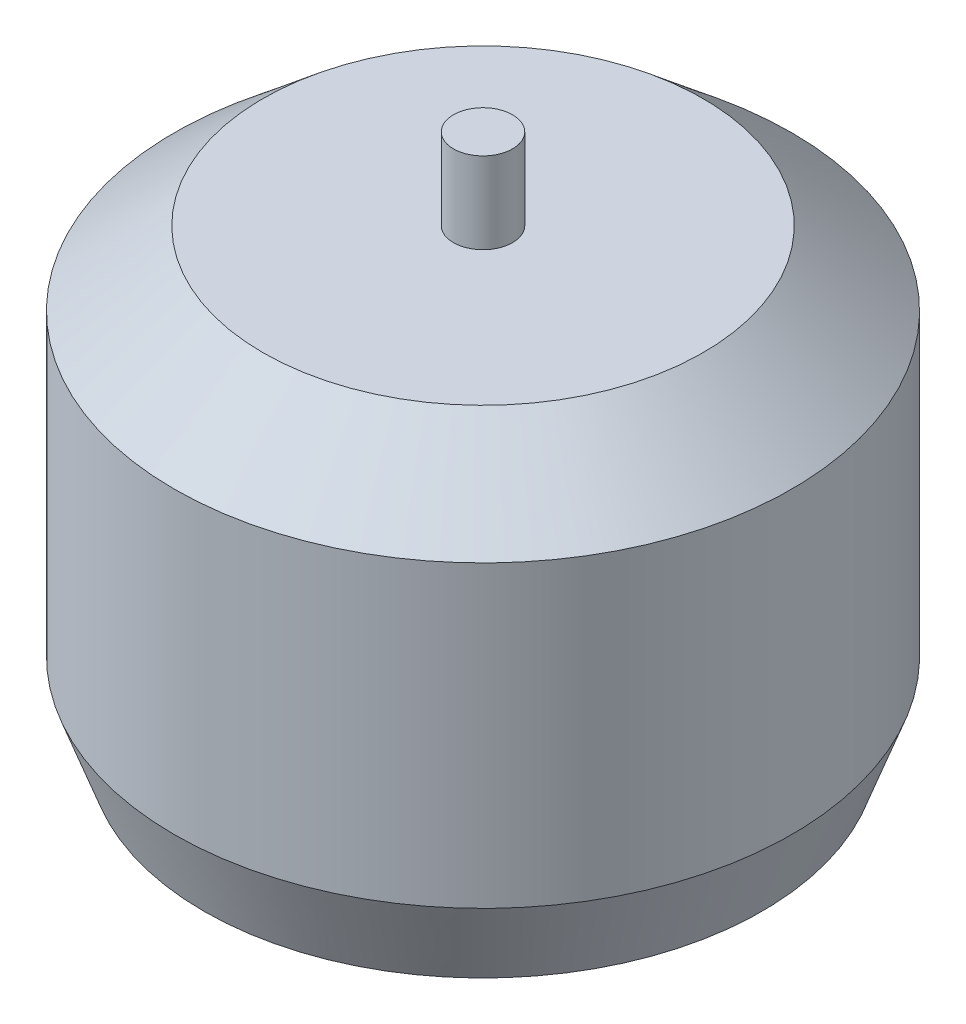
ISO-10303-21;
HEADER;
FILE_DESCRIPTION(('STEP AP214'),'2;1');
FILE_NAME('part.step','',(''),(''),'','','');
FILE_SCHEMA(('AUTOMOTIVE_DESIGN { 1 0 10303 214 1 1 1 1 }'));
ENDSEC;
DATA;
#1=APPLICATION_CONTEXT('core data for automotive mechanical design processes');
#2=APPLICATION_PROTOCOL_DEFINITION('international standard','automotive_design',2000,#1);
#3=PRODUCT_CONTEXT('',#1,'mechanical');
#4=PRODUCT('Part','Part','',(#3));
#5=PRODUCT_RELATED_PRODUCT_CATEGORY('part','',(#4));
#6=PRODUCT_DEFINITION_FORMATION('','',#4);
#7=PRODUCT_DEFINITION_CONTEXT('part definition',#1,'design');
#8=PRODUCT_DEFINITION('design','',#6,#7);
#9=PRODUCT_DEFINITION_SHAPE('','',#8);
#10=(LENGTH_UNIT() NAMED_UNIT(*) SI_UNIT(.MILLI.,.METRE.));
#11=(NAMED_UNIT(*) PLANE_ANGLE_UNIT() SI_UNIT($,.RADIAN.));
#12=(NAMED_UNIT(*) SI_UNIT($,.STERADIAN.) SOLID_ANGLE_UNIT());
#13=UNCERTAINTY_MEASURE_WITH_UNIT(LENGTH_MEASURE(1.E-05),#10,'distance_accuracy_value','');
#14=(GEOMETRIC_REPRESENTATION_CONTEXT(3) GLOBAL_UNCERTAINTY_ASSIGNED_CONTEXT((#13)) GLOBAL_UNIT_ASSIGNED_CONTEXT((#10,
#11,#12)) REPRESENTATION_CONTEXT('',''));
#15=CARTESIAN_POINT('',(0.,0.,0.));
#16=DIRECTION('',(0.,0.,1.));
#17=DIRECTION('',(1.,0.,0.));
#18=AXIS2_PLACEMENT_3D('',#15,#16,#17);
#19=CARTESIAN_POINT('',(-5.64905789440501,30.75,5.32808869585927));
#20=DIRECTION('',(0.,-1.,0.));
#21=DIRECTION('',(0.,0.,-1.));
#22=AXIS2_PLACEMENT_3D('',#19,#20,#21);
#23=CYLINDRICAL_SURFACE('',#22,20.9);
#24=CARTESIAN_POINT('',(-5.64905789440501,5.4949548389092,5.32808869585927));
#25=DIRECTION('',(0.,1.,0.));
#26=DIRECTION('',(0.,0.,1.));
#27=AXIS2_PLACEMENT_3D('',#24,#25,#26);
#28=CIRCLE('',#27,20.9);
#29=CARTESIAN_POINT('',(-5.64905789440501,5.4949548389092,26.2280886958593));
#30=VERTEX_POINT('',#29);
#31=EDGE_CURVE('E46',#30,#30,#28,.T.);
#32=ORIENTED_EDGE('',*,*,#31,.T.);
#33=EDGE_LOOP('',(#32));
#34=FACE_BOUND('',#33,.T.);
#35=CARTESIAN_POINT('',(-5.64905789440501,25.75,5.32808869585927));
#36=DIRECTION('',(0.,1.,0.));
#37=DIRECTION('',(0.,0.,1.));
#38=AXIS2_PLACEMENT_3D('',#35,#36,#37);
#39=CIRCLE('',#38,20.9);
#40=CARTESIAN_POINT('',(-5.64905789440501,25.75,26.2280886958593));
#41=VERTEX_POINT('',#40);
#42=EDGE_CURVE('E50',#41,#41,#39,.F.);
#43=ORIENTED_EDGE('',*,*,#42,.T.);
#44=EDGE_LOOP('',(#43));
#45=FACE_BOUND('',#44,.T.);
#46=ADVANCED_FACE('F35',(#34,#45),#23,.T.);
#47=CARTESIAN_POINT('',(-5.64905789440501,30.75,5.32808869585927));
#48=DIRECTION('',(0.,1.,0.));
#49=DIRECTION('',(0.,0.,1.));
#50=AXIS2_PLACEMENT_3D('',#47,#48,#49);
#51=PLANE('',#50);
#52=CARTESIAN_POINT('',(-5.64905789440501,30.75,5.32808869585927));
#53=DIRECTION('',(0.,1.,0.));
#54=DIRECTION('',(0.,0.,1.));
#55=AXIS2_PLACEMENT_3D('',#52,#53,#54);
#56=CIRCLE('',#55,2.);
#57=CARTESIAN_POINT('',(-5.64905789440501,30.75,7.32808869585927));
#58=VERTEX_POINT('',#57);
#59=EDGE_CURVE('E59',#58,#58,#56,.T.);
#60=ORIENTED_EDGE('',*,*,#59,.F.);
#61=EDGE_LOOP('',(#60));
#62=FACE_BOUND('',#61,.T.);
#63=CARTESIAN_POINT('',(-5.64905789440501,30.75,5.32808869585927));
#64=DIRECTION('',(0.,1.,0.));
#65=DIRECTION('',(0.,0.,1.));
#66=AXIS2_PLACEMENT_3D('',#63,#64,#65);
#67=CIRCLE('',#66,14.8999999999999);
#68=CARTESIAN_POINT('',(-5.64905789440501,30.75,20.2280886958592));
#69=VERTEX_POINT('',#68);
#70=EDGE_CURVE('E55',#69,#69,#67,.T.);
#71=ORIENTED_EDGE('',*,*,#70,.T.);
#72=EDGE_LOOP('',(#71));
#73=FACE_BOUND('',#72,.T.);
#74=ADVANCED_FACE('F141',(#62,#73),#51,.T.);
#75=CARTESIAN_POINT('',(-5.64905789440501,0.,5.32808869585927));
#76=DIRECTION('',(0.,1.,0.));
#77=DIRECTION('',(0.,0.,1.));
#78=AXIS2_PLACEMENT_3D('',#75,#76,#77);
#79=PLANE('',#78);
#80=CARTESIAN_POINT('',(1.06845652686731,0.,-1.38942572541281));
#81=DIRECTION('',(0.,-1.,0.));
#82=DIRECTION('',(0.,0.,1.));
#83=AXIS2_PLACEMENT_3D('',#80,#81,#82);
#84=CIRCLE('',#83,1.);
#85=CARTESIAN_POINT('',(1.06845652686731,0.,-0.389425725412808));
#86=VERTEX_POINT('',#85);
#87=EDGE_CURVE('E105',#86,#86,#84,.T.);
#88=ORIENTED_EDGE('',*,*,#87,.F.);
#89=EDGE_LOOP('',(#88));
#90=FACE_BOUND('',#89,.T.);
#91=CARTESIAN_POINT('',(-11.3059121438974,0.,-0.328765553633108));
#92=DIRECTION('',(0.,-1.,0.));
#93=DIRECTION('',(0.,0.,-1.));
#94=AXIS2_PLACEMENT_3D('',#91,#92,#93);
#95=CIRCLE('',#94,1.);
#96=CARTESIAN_POINT('',(-11.3059121438974,0.,-1.32876555363311));
#97=VERTEX_POINT('',#96);
#98=EDGE_CURVE('E98',#97,#97,#95,.T.);
#99=ORIENTED_EDGE('',*,*,#98,.F.);
#100=EDGE_LOOP('',(#99));
#101=FACE_BOUND('',#100,.T.);
#102=CARTESIAN_POINT('',(3.18977687042674,0.,14.1669234606912));
#103=DIRECTION('',(0.,-1.,0.));
#104=DIRECTION('',(0.,0.,1.));
#105=AXIS2_PLACEMENT_3D('',#102,#103,#104);
#106=CIRCLE('',#105,1.);
#107=CARTESIAN_POINT('',(3.18977687042674,0.,15.1669234606912));
#108=VERTEX_POINT('',#107);
#109=EDGE_CURVE('E116',#108,#108,#106,.T.);
#110=ORIENTED_EDGE('',*,*,#109,.F.);
#111=EDGE_LOOP('',(#110));
#112=FACE_BOUND('',#111,.T.);
#113=CARTESIAN_POINT('',(-14.4878926592369,0.,-3.51074606897257));
#114=DIRECTION('',(0.,-1.,0.));
#115=DIRECTION('',(0.,0.,-1.));
#116=AXIS2_PLACEMENT_3D('',#113,#114,#115);
#117=CIRCLE('',#116,1.);
#118=CARTESIAN_POINT('',(-14.4878926592369,0.,-4.51074606897257));
#119=VERTEX_POINT('',#118);
#120=EDGE_CURVE('E122',#119,#119,#117,.T.);
#121=ORIENTED_EDGE('',*,*,#120,.F.);
#122=EDGE_LOOP('',(#121));
#123=FACE_BOUND('',#122,.T.);
#124=CARTESIAN_POINT('',(0.0077963550873094,0.,10.9849429453517));
#125=DIRECTION('',(0.,-1.,0.));
#126=DIRECTION('',(0.,0.,1.));
#127=AXIS2_PLACEMENT_3D('',#124,#125,#126);
#128=CIRCLE('',#127,1.);
#129=CARTESIAN_POINT('',(0.0077963550873094,0.,11.9849429453517));
#130=VERTEX_POINT('',#129);
#131=EDGE_CURVE('E110',#130,#130,#128,.T.);
#132=ORIENTED_EDGE('',*,*,#131,.F.);
#133=EDGE_LOOP('',(#132));
#134=FACE_BOUND('',#133,.T.);
#135=CARTESIAN_POINT('',(-5.90865819247424,0.,-6.82985859704994));
#136=DIRECTION('',(0.,-1.,0.));
#137=DIRECTION('',(0.,0.,1.));
#138=AXIS2_PLACEMENT_3D('',#135,#136,#137);
#139=CIRCLE('',#138,4.);
#140=CARTESIAN_POINT('',(-5.90865819247424,0.,-2.82985859704994));
#141=VERTEX_POINT('',#140);
#142=EDGE_CURVE('E81',#141,#141,#139,.T.);
#143=ORIENTED_EDGE('',*,*,#142,.F.);
#144=EDGE_LOOP('',(#143));
#145=FACE_BOUND('',#144,.T.);
#146=CARTESIAN_POINT('',(-17.8070051873142,0.,5.58768899392838));
#147=DIRECTION('',(0.,-1.,0.));
#148=DIRECTION('',(0.,0.,1.));
#149=AXIS2_PLACEMENT_3D('',#146,#147,#148);
#150=CIRCLE('',#149,4.);
#151=CARTESIAN_POINT('',(-17.8070051873142,0.,9.58768899392838));
#152=VERTEX_POINT('',#151);
#153=EDGE_CURVE('E74',#152,#152,#150,.T.);
#154=ORIENTED_EDGE('',*,*,#153,.F.);
#155=EDGE_LOOP('',(#154));
#156=FACE_BOUND('',#155,.T.);
#157=CARTESIAN_POINT('',(5.98968880236575,0.,5.58768899392838));
#158=DIRECTION('',(0.,-1.,0.));
#159=DIRECTION('',(0.,0.,-1.));
#160=AXIS2_PLACEMENT_3D('',#157,#158,#159);
#161=CIRCLE('',#160,4.);
#162=CARTESIAN_POINT('',(5.98968880236575,0.,1.58768899392839));
#163=VERTEX_POINT('',#162);
#164=EDGE_CURVE('E93',#163,#163,#161,.T.);
#165=ORIENTED_EDGE('',*,*,#164,.F.);
#166=EDGE_LOOP('',(#165));
#167=FACE_BOUND('',#166,.T.);
#168=CARTESIAN_POINT('',(-12.3665723156772,0.,12.0456031171315));
#169=DIRECTION('',(0.,-1.,0.));
#170=DIRECTION('',(0.,0.,-1.));
#171=AXIS2_PLACEMENT_3D('',#168,#169,#170);
#172=CIRCLE('',#171,1.);
#173=CARTESIAN_POINT('',(-12.3665723156772,0.,11.0456031171315));
#174=VERTEX_POINT('',#173);
#175=EDGE_CURVE('E86',#174,#174,#172,.T.);
#176=ORIENTED_EDGE('',*,*,#175,.F.);
#177=EDGE_LOOP('',(#176));
#178=FACE_BOUND('',#177,.T.);
#179=CARTESIAN_POINT('',(-5.90865819247424,0.,17.4860359887685));
#180=DIRECTION('',(0.,-1.,0.));
#181=DIRECTION('',(0.,0.,-1.));
#182=AXIS2_PLACEMENT_3D('',#179,#180,#181);
#183=CIRCLE('',#182,4.);
#184=CARTESIAN_POINT('',(-5.90865819247424,0.,13.4860359887685));
#185=VERTEX_POINT('',#184);
#186=EDGE_CURVE('E68',#185,#185,#183,.T.);
#187=ORIENTED_EDGE('',*,*,#186,.F.);
#188=EDGE_LOOP('',(#187));
#189=FACE_BOUND('',#188,.T.);
#190=CARTESIAN_POINT('',(-5.64905789440501,0.,5.32808869585927));
#191=DIRECTION('',(0.,1.,0.));
#192=DIRECTION('',(0.,0.,1.));
#193=AXIS2_PLACEMENT_3D('',#190,#191,#192);
#194=CIRCLE('',#193,4.);
#195=CARTESIAN_POINT('',(-5.64905789440501,0.,9.32808869585928));
#196=VERTEX_POINT('',#195);
#197=EDGE_CURVE('E10',#196,#196,#194,.F.);
#198=ORIENTED_EDGE('',*,*,#197,.F.);
#199=EDGE_LOOP('',(#198));
#200=FACE_BOUND('',#199,.T.);
#201=CARTESIAN_POINT('',(-5.64905789440501,0.,5.32808869585927));
#202=DIRECTION('',(0.,1.,0.));
#203=DIRECTION('',(0.,0.,1.));
#204=AXIS2_PLACEMENT_3D('',#201,#202,#203);
#205=CIRCLE('',#204,18.9);
#206=CARTESIAN_POINT('',(-5.64905789440501,0.,24.2280886958593));
#207=VERTEX_POINT('',#206);
#208=EDGE_CURVE('E42',#207,#207,#205,.F.);
#209=ORIENTED_EDGE('',*,*,#208,.T.);
#210=EDGE_LOOP('',(#209));
#211=FACE_BOUND('',#210,.T.);
#212=ADVANCED_FACE('F137',(#90,#101,#112,#123,#134,#145,#156,#167,#178,#189,#200,#211),#79,.F.);
#213=CARTESIAN_POINT('',(-5.64905789440501,30.75,5.32808869585927));
#214=DIRECTION('',(0.,-1.,0.));
#215=DIRECTION('',(0.,0.,-1.));
#216=AXIS2_PLACEMENT_3D('',#213,#214,#215);
#217=CONICAL_SURFACE('',#216,14.8999999999999,0.876058050598194);
#218=ORIENTED_EDGE('',*,*,#42,.F.);
#219=EDGE_LOOP('',(#218));
#220=FACE_BOUND('',#219,.T.);
#221=ORIENTED_EDGE('',*,*,#70,.F.);
#222=EDGE_LOOP('',(#221));
#223=FACE_BOUND('',#222,.T.);
#224=ADVANCED_FACE('F140',(#220,#223),#217,.T.);
#225=CARTESIAN_POINT('',(-5.64905789440501,5.4949548389092,5.32808869585927));
#226=DIRECTION('',(0.,1.,0.));
#227=DIRECTION('',(0.,0.,1.));
#228=AXIS2_PLACEMENT_3D('',#225,#226,#227);
#229=CONICAL_SURFACE('',#228,20.9,0.349065850398867);
#230=ORIENTED_EDGE('',*,*,#208,.F.);
#231=EDGE_LOOP('',(#230));
#232=FACE_BOUND('',#231,.T.);
#233=ORIENTED_EDGE('',*,*,#31,.F.);
#234=EDGE_LOOP('',(#233));
#235=FACE_BOUND('',#234,.T.);
#236=ADVANCED_FACE('F37',(#232,#235),#229,.T.);
#237=CARTESIAN_POINT('',(-5.64905789440501,36.25,5.32808869585927));
#238=DIRECTION('',(0.,-1.,0.));
#239=DIRECTION('',(0.,0.,-1.));
#240=AXIS2_PLACEMENT_3D('',#237,#238,#239);
#241=CYLINDRICAL_SURFACE('',#240,2.);
#242=CARTESIAN_POINT('',(-5.64905789440501,36.25,5.32808869585927));
#243=DIRECTION('',(0.,1.,0.));
#244=DIRECTION('',(0.,0.,1.));
#245=AXIS2_PLACEMENT_3D('',#242,#243,#244);
#246=CIRCLE('',#245,2.);
#247=CARTESIAN_POINT('',(-5.64905789440501,36.25,7.32808869585927));
#248=VERTEX_POINT('',#247);
#249=EDGE_CURVE('E58',#248,#248,#246,.T.);
#250=ORIENTED_EDGE('',*,*,#249,.F.);
#251=EDGE_LOOP('',(#250));
#252=FACE_BOUND('',#251,.T.);
#253=ORIENTED_EDGE('',*,*,#59,.T.);
#254=EDGE_LOOP('',(#253));
#255=FACE_BOUND('',#254,.T.);
#256=ADVANCED_FACE('F188',(#252,#255),#241,.T.);
#257=CARTESIAN_POINT('',(-5.64905789440501,36.25,5.32808869585927));
#258=DIRECTION('',(0.,1.,0.));
#259=DIRECTION('',(0.,0.,1.));
#260=AXIS2_PLACEMENT_3D('',#257,#258,#259);
#261=PLANE('',#260);
#262=ORIENTED_EDGE('',*,*,#249,.T.);
#263=EDGE_LOOP('',(#262));
#264=FACE_BOUND('',#263,.T.);
#265=ADVANCED_FACE('F197',(#264),#261,.T.);
#266=CARTESIAN_POINT('',(-5.64905789440501,-2.55,5.32808869585927));
#267=DIRECTION('',(0.,1.,0.));
#268=DIRECTION('',(0.,0.,1.));
#269=AXIS2_PLACEMENT_3D('',#266,#267,#268);
#270=CYLINDRICAL_SURFACE('',#269,4.);
#271=CARTESIAN_POINT('',(-5.64905789440501,-2.55,5.32808869585927));
#272=DIRECTION('',(0.,-1.,0.));
#273=DIRECTION('',(0.,0.,-1.));
#274=AXIS2_PLACEMENT_3D('',#271,#272,#273);
#275=CIRCLE('',#274,4.);
#276=CARTESIAN_POINT('',(-5.64905789440501,-2.55,1.32808869585927));
#277=VERTEX_POINT('',#276);
#278=EDGE_CURVE('E62',#277,#277,#275,.T.);
#279=ORIENTED_EDGE('',*,*,#278,.F.);
#280=EDGE_LOOP('',(#279));
#281=FACE_BOUND('',#280,.T.);
#282=ORIENTED_EDGE('',*,*,#197,.T.);
#283=EDGE_LOOP('',(#282));
#284=FACE_BOUND('',#283,.T.);
#285=ADVANCED_FACE('F170',(#281,#284),#270,.T.);
#286=CARTESIAN_POINT('',(-5.64905789440501,-2.55,5.32808869585927));
#287=DIRECTION('',(0.,-1.,0.));
#288=DIRECTION('',(0.,0.,-1.));
#289=AXIS2_PLACEMENT_3D('',#286,#287,#288);
#290=PLANE('',#289);
#291=ORIENTED_EDGE('',*,*,#278,.T.);
#292=EDGE_LOOP('',(#291));
#293=FACE_BOUND('',#292,.T.);
#294=ADVANCED_FACE('F160',(#293),#290,.T.);
#295=CARTESIAN_POINT('',(-5.90865819247424,1.5875,17.4860359887685));
#296=DIRECTION('',(0.,-1.,0.));
#297=DIRECTION('',(0.,0.,-1.));
#298=AXIS2_PLACEMENT_3D('',#295,#296,#297);
#299=CYLINDRICAL_SURFACE('',#298,4.);
#300=CARTESIAN_POINT('',(-5.90865819247424,1.5875,17.4860359887685));
#301=DIRECTION('',(0.,-1.,0.));
#302=DIRECTION('',(0.,0.,-1.));
#303=AXIS2_PLACEMENT_3D('',#300,#301,#302);
#304=CIRCLE('',#303,4.);
#305=CARTESIAN_POINT('',(-5.90865819247424,1.5875,13.4860359887685));
#306=VERTEX_POINT('',#305);
#307=EDGE_CURVE('E67',#306,#306,#304,.T.);
#308=ORIENTED_EDGE('',*,*,#307,.F.);
#309=EDGE_LOOP('',(#308));
#310=FACE_BOUND('',#309,.T.);
#311=ORIENTED_EDGE('',*,*,#186,.T.);
#312=EDGE_LOOP('',(#311));
#313=FACE_BOUND('',#312,.T.);
#314=ADVANCED_FACE('F157',(#310,#313),#299,.F.);
#315=CARTESIAN_POINT('',(-5.90865819247424,1.5875,17.4860359887685));
#316=DIRECTION('',(0.,-1.,0.));
#317=DIRECTION('',(0.,0.,-1.));
#318=AXIS2_PLACEMENT_3D('',#315,#316,#317);
#319=PLANE('',#318);
#320=ORIENTED_EDGE('',*,*,#307,.T.);
#321=EDGE_LOOP('',(#320));
#322=FACE_BOUND('',#321,.T.);
#323=ADVANCED_FACE('F159',(#322),#319,.T.);
#324=CARTESIAN_POINT('',(-12.3665723156772,1.5875,12.0456031171315));
#325=DIRECTION('',(0.,-1.,0.));
#326=DIRECTION('',(0.,0.,-1.));
#327=AXIS2_PLACEMENT_3D('',#324,#325,#326);
#328=CYLINDRICAL_SURFACE('',#327,1.);
#329=CARTESIAN_POINT('',(-12.3665723156772,1.5875,12.0456031171315));
#330=DIRECTION('',(0.,-1.,0.));
#331=DIRECTION('',(0.,0.,-1.));
#332=AXIS2_PLACEMENT_3D('',#329,#330,#331);
#333=CIRCLE('',#332,1.);
#334=CARTESIAN_POINT('',(-12.3665723156772,1.5875,11.0456031171315));
#335=VERTEX_POINT('',#334);
#336=EDGE_CURVE('E89',#335,#335,#333,.T.);
#337=ORIENTED_EDGE('',*,*,#336,.F.);
#338=EDGE_LOOP('',(#337));
#339=FACE_BOUND('',#338,.T.);
#340=ORIENTED_EDGE('',*,*,#175,.T.);
#341=EDGE_LOOP('',(#340));
#342=FACE_BOUND('',#341,.T.);
#343=ADVANCED_FACE('F167',(#339,#342),#328,.F.);
#344=CARTESIAN_POINT('',(-12.3665723156772,1.5875,12.0456031171315));
#345=DIRECTION('',(0.,-1.,0.));
#346=DIRECTION('',(0.,0.,-1.));
#347=AXIS2_PLACEMENT_3D('',#344,#345,#346);
#348=PLANE('',#347);
#349=ORIENTED_EDGE('',*,*,#336,.T.);
#350=EDGE_LOOP('',(#349));
#351=FACE_BOUND('',#350,.T.);
#352=ADVANCED_FACE('F248',(#351),#348,.T.);
#353=CARTESIAN_POINT('',(5.98968880236575,1.5875,5.58768899392838));
#354=DIRECTION('',(0.,-1.,0.));
#355=DIRECTION('',(0.,0.,-1.));
#356=AXIS2_PLACEMENT_3D('',#353,#354,#355);
#357=CYLINDRICAL_SURFACE('',#356,4.);
#358=CARTESIAN_POINT('',(5.98968880236575,1.5875,5.58768899392838));
#359=DIRECTION('',(0.,-1.,0.));
#360=DIRECTION('',(0.,0.,-1.));
#361=AXIS2_PLACEMENT_3D('',#358,#359,#360);
#362=CIRCLE('',#361,4.);
#363=CARTESIAN_POINT('',(5.98968880236575,1.5875,1.58768899392839));
#364=VERTEX_POINT('',#363);
#365=EDGE_CURVE('E78',#364,#364,#362,.T.);
#366=ORIENTED_EDGE('',*,*,#365,.F.);
#367=EDGE_LOOP('',(#366));
#368=FACE_BOUND('',#367,.T.);
#369=ORIENTED_EDGE('',*,*,#164,.T.);
#370=EDGE_LOOP('',(#369));
#371=FACE_BOUND('',#370,.T.);
#372=ADVANCED_FACE('F258',(#368,#371),#357,.F.);
#373=CARTESIAN_POINT('',(5.98968880236575,1.5875,5.58768899392838));
#374=DIRECTION('',(0.,-1.,0.));
#375=DIRECTION('',(0.,0.,-1.));
#376=AXIS2_PLACEMENT_3D('',#373,#374,#375);
#377=PLANE('',#376);
#378=ORIENTED_EDGE('',*,*,#365,.T.);
#379=EDGE_LOOP('',(#378));
#380=FACE_BOUND('',#379,.T.);
#381=ADVANCED_FACE('F268',(#380),#377,.T.);
#382=CARTESIAN_POINT('',(-17.8070051873142,1.5875,5.58768899392838));
#383=DIRECTION('',(0.,-1.,0.));
#384=DIRECTION('',(0.,0.,-1.));
#385=AXIS2_PLACEMENT_3D('',#382,#383,#384);
#386=CYLINDRICAL_SURFACE('',#385,4.);
#387=CARTESIAN_POINT('',(-17.8070051873142,1.5875,5.58768899392838));
#388=DIRECTION('',(0.,-1.,0.));
#389=DIRECTION('',(0.,0.,1.));
#390=AXIS2_PLACEMENT_3D('',#387,#388,#389);
#391=CIRCLE('',#390,4.);
#392=CARTESIAN_POINT('',(-17.8070051873142,1.5875,9.58768899392838));
#393=VERTEX_POINT('',#392);
#394=EDGE_CURVE('E77',#393,#393,#391,.T.);
#395=ORIENTED_EDGE('',*,*,#394,.F.);
#396=EDGE_LOOP('',(#395));
#397=FACE_BOUND('',#396,.T.);
#398=ORIENTED_EDGE('',*,*,#153,.T.);
#399=EDGE_LOOP('',(#398));
#400=FACE_BOUND('',#399,.T.);
#401=ADVANCED_FACE('F278',(#397,#400),#386,.F.);
#402=CARTESIAN_POINT('',(-17.8070051873142,1.5875,5.58768899392838));
#403=DIRECTION('',(0.,1.,0.));
#404=DIRECTION('',(0.,0.,1.));
#405=AXIS2_PLACEMENT_3D('',#402,#403,#404);
#406=PLANE('',#405);
#407=ORIENTED_EDGE('',*,*,#394,.T.);
#408=EDGE_LOOP('',(#407));
#409=FACE_BOUND('',#408,.T.);
#410=ADVANCED_FACE('F288',(#409),#406,.F.);
#411=CARTESIAN_POINT('',(-5.90865819247424,1.5875,-6.82985859704994));
#412=DIRECTION('',(0.,-1.,0.));
#413=DIRECTION('',(0.,0.,-1.));
#414=AXIS2_PLACEMENT_3D('',#411,#412,#413);
#415=CYLINDRICAL_SURFACE('',#414,4.);
#416=CARTESIAN_POINT('',(-5.90865819247424,1.5875,-6.82985859704994));
#417=DIRECTION('',(0.,-1.,0.));
#418=DIRECTION('',(0.,0.,1.));
#419=AXIS2_PLACEMENT_3D('',#416,#417,#418);
#420=CIRCLE('',#419,4.);
#421=CARTESIAN_POINT('',(-5.90865819247424,1.5875,-2.82985859704994));
#422=VERTEX_POINT('',#421);
#423=EDGE_CURVE('E71',#422,#422,#420,.T.);
#424=ORIENTED_EDGE('',*,*,#423,.F.);
#425=EDGE_LOOP('',(#424));
#426=FACE_BOUND('',#425,.T.);
#427=ORIENTED_EDGE('',*,*,#142,.T.);
#428=EDGE_LOOP('',(#427));
#429=FACE_BOUND('',#428,.T.);
#430=ADVANCED_FACE('F298',(#426,#429),#415,.F.);
#431=CARTESIAN_POINT('',(-5.90865819247424,1.5875,-6.82985859704994));
#432=DIRECTION('',(0.,1.,0.));
#433=DIRECTION('',(0.,0.,1.));
#434=AXIS2_PLACEMENT_3D('',#431,#432,#433);
#435=PLANE('',#434);
#436=ORIENTED_EDGE('',*,*,#423,.T.);
#437=EDGE_LOOP('',(#436));
#438=FACE_BOUND('',#437,.T.);
#439=ADVANCED_FACE('F308',(#438),#435,.F.);
#440=CARTESIAN_POINT('',(0.0077963550873094,1.5875,10.9849429453517));
#441=DIRECTION('',(0.,-1.,0.));
#442=DIRECTION('',(0.,0.,-1.));
#443=AXIS2_PLACEMENT_3D('',#440,#441,#442);
#444=CYLINDRICAL_SURFACE('',#443,1.);
#445=CARTESIAN_POINT('',(0.0077963550873094,1.5875,10.9849429453517));
#446=DIRECTION('',(0.,-1.,0.));
#447=DIRECTION('',(0.,0.,1.));
#448=AXIS2_PLACEMENT_3D('',#445,#446,#447);
#449=CIRCLE('',#448,1.);
#450=CARTESIAN_POINT('',(0.0077963550873094,1.5875,11.9849429453517));
#451=VERTEX_POINT('',#450);
#452=EDGE_CURVE('E102',#451,#451,#449,.T.);
#453=ORIENTED_EDGE('',*,*,#452,.F.);
#454=EDGE_LOOP('',(#453));
#455=FACE_BOUND('',#454,.T.);
#456=ORIENTED_EDGE('',*,*,#131,.T.);
#457=EDGE_LOOP('',(#456));
#458=FACE_BOUND('',#457,.T.);
#459=ADVANCED_FACE('F318',(#455,#458),#444,.F.);
#460=CARTESIAN_POINT('',(0.0077963550873094,1.5875,10.9849429453517));
#461=DIRECTION('',(0.,1.,0.));
#462=DIRECTION('',(0.,0.,1.));
#463=AXIS2_PLACEMENT_3D('',#460,#461,#462);
#464=PLANE('',#463);
#465=ORIENTED_EDGE('',*,*,#452,.T.);
#466=EDGE_LOOP('',(#465));
#467=FACE_BOUND('',#466,.T.);
#468=ADVANCED_FACE('F133',(#467),#464,.F.);
#469=CARTESIAN_POINT('',(-14.4878926592369,1.5875,-3.51074606897257));
#470=DIRECTION('',(0.,-1.,0.));
#471=DIRECTION('',(0.,0.,-1.));
#472=AXIS2_PLACEMENT_3D('',#469,#470,#471);
#473=CYLINDRICAL_SURFACE('',#472,1.);
#474=CARTESIAN_POINT('',(-14.4878926592369,1.5875,-3.51074606897257));
#475=DIRECTION('',(0.,-1.,0.));
#476=DIRECTION('',(0.,0.,-1.));
#477=AXIS2_PLACEMENT_3D('',#474,#475,#476);
#478=CIRCLE('',#477,1.);
#479=CARTESIAN_POINT('',(-14.4878926592369,1.5875,-4.51074606897257));
#480=VERTEX_POINT('',#479);
#481=EDGE_CURVE('E113',#480,#480,#478,.T.);
#482=ORIENTED_EDGE('',*,*,#481,.F.);
#483=EDGE_LOOP('',(#482));
#484=FACE_BOUND('',#483,.T.);
#485=ORIENTED_EDGE('',*,*,#120,.T.);
#486=EDGE_LOOP('',(#485));
#487=FACE_BOUND('',#486,.T.);
#488=ADVANCED_FACE('F130',(#484,#487),#473,.F.);
#489=CARTESIAN_POINT('',(-14.4878926592369,1.5875,-3.51074606897257));
#490=DIRECTION('',(0.,-1.,0.));
#491=DIRECTION('',(0.,0.,-1.));
#492=AXIS2_PLACEMENT_3D('',#489,#490,#491);
#493=PLANE('',#492);
#494=ORIENTED_EDGE('',*,*,#481,.T.);
#495=EDGE_LOOP('',(#494));
#496=FACE_BOUND('',#495,.T.);
#497=ADVANCED_FACE('F128',(#496),#493,.T.);
#498=CARTESIAN_POINT('',(3.18977687042674,1.5875,14.1669234606912));
#499=DIRECTION('',(0.,-1.,0.));
#500=DIRECTION('',(0.,0.,-1.));
#501=AXIS2_PLACEMENT_3D('',#498,#499,#500);
#502=CYLINDRICAL_SURFACE('',#501,1.);
#503=CARTESIAN_POINT('',(3.18977687042674,1.5875,14.1669234606912));
#504=DIRECTION('',(0.,-1.,0.));
#505=DIRECTION('',(0.,0.,1.));
#506=AXIS2_PLACEMENT_3D('',#503,#504,#505);
#507=CIRCLE('',#506,1.);
#508=CARTESIAN_POINT('',(3.18977687042674,1.5875,15.1669234606912));
#509=VERTEX_POINT('',#508);
#510=EDGE_CURVE('E119',#509,#509,#507,.T.);
#511=ORIENTED_EDGE('',*,*,#510,.F.);
#512=EDGE_LOOP('',(#511));
#513=FACE_BOUND('',#512,.T.);
#514=ORIENTED_EDGE('',*,*,#109,.T.);
#515=EDGE_LOOP('',(#514));
#516=FACE_BOUND('',#515,.T.);
#517=ADVANCED_FACE('F352',(#513,#516),#502,.F.);
#518=CARTESIAN_POINT('',(3.18977687042674,1.5875,14.1669234606912));
#519=DIRECTION('',(0.,1.,0.));
#520=DIRECTION('',(0.,0.,1.));
#521=AXIS2_PLACEMENT_3D('',#518,#519,#520);
#522=PLANE('',#521);
#523=ORIENTED_EDGE('',*,*,#510,.T.);
#524=EDGE_LOOP('',(#523));
#525=FACE_BOUND('',#524,.T.);
#526=ADVANCED_FACE('F361',(#525),#522,.F.);
#527=CARTESIAN_POINT('',(-11.3059121438974,1.5875,-0.328765553633108));
#528=DIRECTION('',(0.,-1.,0.));
#529=DIRECTION('',(0.,0.,-1.));
#530=AXIS2_PLACEMENT_3D('',#527,#528,#529);
#531=CYLINDRICAL_SURFACE('',#530,1.);
#532=CARTESIAN_POINT('',(-11.3059121438974,1.5875,-0.328765553633108));
#533=DIRECTION('',(0.,-1.,0.));
#534=DIRECTION('',(0.,0.,-1.));
#535=AXIS2_PLACEMENT_3D('',#532,#533,#534);
#536=CIRCLE('',#535,1.);
#537=CARTESIAN_POINT('',(-11.3059121438974,1.5875,-1.32876555363311));
#538=VERTEX_POINT('',#537);
#539=EDGE_CURVE('E101',#538,#538,#536,.T.);
#540=ORIENTED_EDGE('',*,*,#539,.F.);
#541=EDGE_LOOP('',(#540));
#542=FACE_BOUND('',#541,.T.);
#543=ORIENTED_EDGE('',*,*,#98,.T.);
#544=EDGE_LOOP('',(#543));
#545=FACE_BOUND('',#544,.T.);
#546=ADVANCED_FACE('F371',(#542,#545),#531,.F.);
#547=CARTESIAN_POINT('',(-11.3059121438974,1.5875,-0.328765553633108));
#548=DIRECTION('',(0.,-1.,0.));
#549=DIRECTION('',(0.,0.,-1.));
#550=AXIS2_PLACEMENT_3D('',#547,#548,#549);
#551=PLANE('',#550);
#552=ORIENTED_EDGE('',*,*,#539,.T.);
#553=EDGE_LOOP('',(#552));
#554=FACE_BOUND('',#553,.T.);
#555=ADVANCED_FACE('F381',(#554),#551,.T.);
#556=CARTESIAN_POINT('',(1.06845652686731,1.5875,-1.38942572541281));
#557=DIRECTION('',(0.,-1.,0.));
#558=DIRECTION('',(0.,0.,-1.));
#559=AXIS2_PLACEMENT_3D('',#556,#557,#558);
#560=CYLINDRICAL_SURFACE('',#559,1.);
#561=CARTESIAN_POINT('',(1.06845652686731,1.5875,-1.38942572541281));
#562=DIRECTION('',(0.,-1.,0.));
#563=DIRECTION('',(0.,0.,1.));
#564=AXIS2_PLACEMENT_3D('',#561,#562,#563);
#565=CIRCLE('',#564,1.);
#566=CARTESIAN_POINT('',(1.06845652686731,1.5875,-0.389425725412808));
#567=VERTEX_POINT('',#566);
#568=EDGE_CURVE('E90',#567,#567,#565,.T.);
#569=ORIENTED_EDGE('',*,*,#568,.F.);
#570=EDGE_LOOP('',(#569));
#571=FACE_BOUND('',#570,.T.);
#572=ORIENTED_EDGE('',*,*,#87,.T.);
#573=EDGE_LOOP('',(#572));
#574=FACE_BOUND('',#573,.T.);
#575=ADVANCED_FACE('F391',(#571,#574),#560,.F.);
#576=CARTESIAN_POINT('',(1.06845652686731,1.5875,-1.38942572541281));
#577=DIRECTION('',(0.,1.,0.));
#578=DIRECTION('',(0.,0.,1.));
#579=AXIS2_PLACEMENT_3D('',#576,#577,#578);
#580=PLANE('',#579);
#581=ORIENTED_EDGE('',*,*,#568,.T.);
#582=EDGE_LOOP('',(#581));
#583=FACE_BOUND('',#582,.T.);
#584=ADVANCED_FACE('F401',(#583),#580,.F.);
#585=CLOSED_SHELL('',(#46,#74,#212,#224,#236,#256,#265,#285,#294,#314,#323,#343,#352,#372,#381,
#401,#410,#430,#439,#459,#468,#488,#497,#517,#526,#546,#555,#575,#584));
#586=MANIFOLD_SOLID_BREP('B2',#585);
#587=ADVANCED_BREP_SHAPE_REPRESENTATION('',(#18,#586),#14);
#588=SHAPE_DEFINITION_REPRESENTATION(#9,#587);
ENDSEC;
END-ISO-10303-21;
